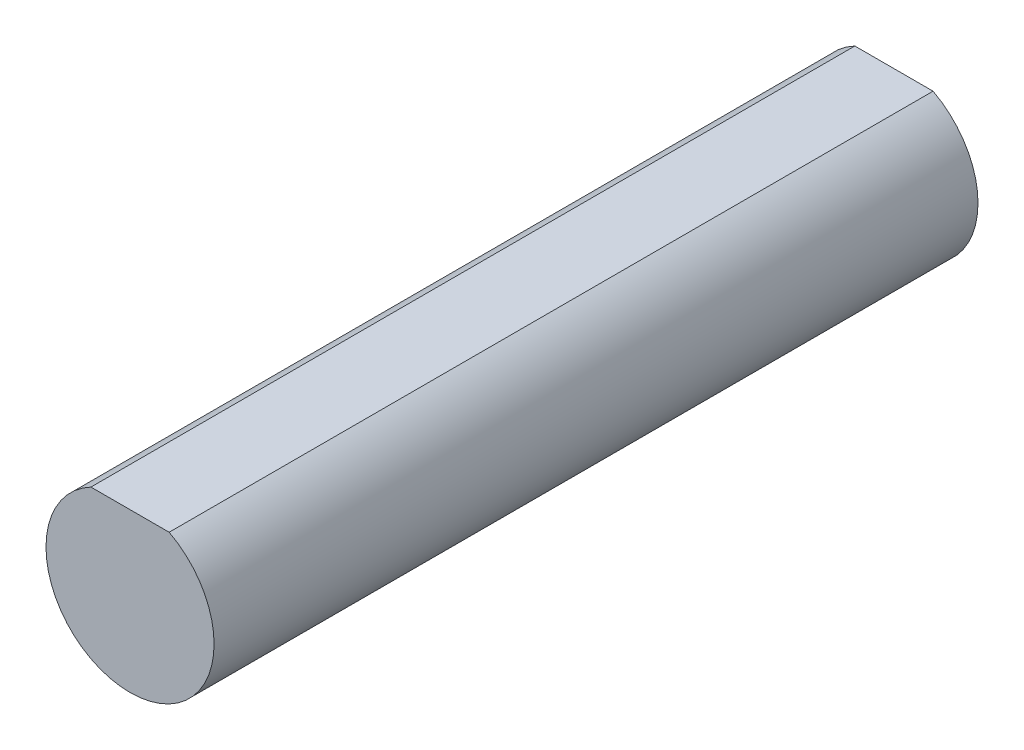
ISO-10303-21;
HEADER;
FILE_DESCRIPTION(('STEP AP214'),'2;1');
FILE_NAME('part.step','',(''),(''),'','','');
FILE_SCHEMA(('AUTOMOTIVE_DESIGN { 1 0 10303 214 1 1 1 1 }'));
ENDSEC;
DATA;
#1=APPLICATION_CONTEXT('core data for automotive mechanical design processes');
#2=APPLICATION_PROTOCOL_DEFINITION('international standard','automotive_design',2000,#1);
#3=PRODUCT_CONTEXT('',#1,'mechanical');
#4=PRODUCT('Part','Part','',(#3));
#5=PRODUCT_RELATED_PRODUCT_CATEGORY('part','',(#4));
#6=PRODUCT_DEFINITION_FORMATION('','',#4);
#7=PRODUCT_DEFINITION_CONTEXT('part definition',#1,'design');
#8=PRODUCT_DEFINITION('design','',#6,#7);
#9=PRODUCT_DEFINITION_SHAPE('','',#8);
#10=(LENGTH_UNIT() NAMED_UNIT(*) SI_UNIT(.MILLI.,.METRE.));
#11=(NAMED_UNIT(*) PLANE_ANGLE_UNIT() SI_UNIT($,.RADIAN.));
#12=(NAMED_UNIT(*) SI_UNIT($,.STERADIAN.) SOLID_ANGLE_UNIT());
#13=UNCERTAINTY_MEASURE_WITH_UNIT(LENGTH_MEASURE(1.E-05),#10,'distance_accuracy_value','');
#14=(GEOMETRIC_REPRESENTATION_CONTEXT(3) GLOBAL_UNCERTAINTY_ASSIGNED_CONTEXT((#13)) GLOBAL_UNIT_ASSIGNED_CONTEXT((#10,
#11,#12)) REPRESENTATION_CONTEXT('',''));
#15=CARTESIAN_POINT('',(0.,0.,0.));
#16=DIRECTION('',(0.,0.,1.));
#17=DIRECTION('',(1.,0.,0.));
#18=AXIS2_PLACEMENT_3D('',#15,#16,#17);
#19=CARTESIAN_POINT('',(0.,0.,0.));
#20=DIRECTION('',(0.,0.,1.));
#21=DIRECTION('',(1.,0.,0.));
#22=AXIS2_PLACEMENT_3D('',#19,#20,#21);
#23=PLANE('',#22);
#24=CARTESIAN_POINT('',(0.,0.,0.));
#25=DIRECTION('',(0.,0.,1.));
#26=DIRECTION('',(1.,0.,0.));
#27=AXIS2_PLACEMENT_3D('',#24,#25,#26);
#28=CIRCLE('',#27,2.54);
#29=CARTESIAN_POINT('',(-1.18260119651555,2.2479,0.));
#30=VERTEX_POINT('',#29);
#31=CARTESIAN_POINT('',(1.18260119651555,2.2479,0.));
#32=VERTEX_POINT('',#31);
#33=EDGE_CURVE('E52',#30,#32,#28,.T.);
#34=ORIENTED_EDGE('',*,*,#33,.F.);
#35=DIRECTION('',(-1.,0.,0.));
#36=VECTOR('',#35,1.);
#37=CARTESIAN_POINT('',(1.18260119651555,2.2479,0.));
#38=LINE('',#37,#36);
#39=EDGE_CURVE('E75',#32,#30,#38,.T.);
#40=ORIENTED_EDGE('',*,*,#39,.F.);
#41=EDGE_LOOP('',(#34,#40));
#42=FACE_BOUND('',#41,.T.);
#43=ADVANCED_FACE('F48',(#42),#23,.F.);
#44=CARTESIAN_POINT('',(0.,0.,23.0886));
#45=DIRECTION('',(0.,0.,-1.));
#46=DIRECTION('',(-1.,0.,0.));
#47=AXIS2_PLACEMENT_3D('',#44,#45,#46);
#48=CYLINDRICAL_SURFACE('',#47,2.54);
#49=CARTESIAN_POINT('',(0.,0.,23.0886));
#50=DIRECTION('',(0.,0.,1.));
#51=DIRECTION('',(1.,0.,0.));
#52=AXIS2_PLACEMENT_3D('',#49,#50,#51);
#53=CIRCLE('',#52,2.54);
#54=CARTESIAN_POINT('',(-1.18260119651555,2.2479,23.0886));
#55=VERTEX_POINT('',#54);
#56=CARTESIAN_POINT('',(1.18260119651555,2.2479,23.0886));
#57=VERTEX_POINT('',#56);
#58=EDGE_CURVE('E12',#55,#57,#53,.T.);
#59=ORIENTED_EDGE('',*,*,#58,.F.);
#60=DIRECTION('',(0.,0.,-1.));
#61=VECTOR('',#60,1.);
#62=CARTESIAN_POINT('',(-1.18260119651555,2.2479,23.0886));
#63=LINE('',#62,#61);
#64=EDGE_CURVE('E63',#55,#30,#63,.T.);
#65=ORIENTED_EDGE('',*,*,#64,.T.);
#66=ORIENTED_EDGE('',*,*,#33,.T.);
#67=DIRECTION('',(0.,0.,-1.));
#68=VECTOR('',#67,1.);
#69=CARTESIAN_POINT('',(1.18260119651555,2.2479,23.0886));
#70=LINE('',#69,#68);
#71=EDGE_CURVE('E72',#57,#32,#70,.T.);
#72=ORIENTED_EDGE('',*,*,#71,.F.);
#73=EDGE_LOOP('',(#59,#65,#66,#72));
#74=FACE_BOUND('',#73,.T.);
#75=ADVANCED_FACE('F50',(#74),#48,.T.);
#76=CARTESIAN_POINT('',(0.,0.,23.0886));
#77=DIRECTION('',(0.,0.,1.));
#78=DIRECTION('',(1.,0.,0.));
#79=AXIS2_PLACEMENT_3D('',#76,#77,#78);
#80=PLANE('',#79);
#81=DIRECTION('',(-1.,0.,0.));
#82=VECTOR('',#81,1.);
#83=CARTESIAN_POINT('',(1.18260119651555,2.2479,23.0886));
#84=LINE('',#83,#82);
#85=EDGE_CURVE('E68',#57,#55,#84,.T.);
#86=ORIENTED_EDGE('',*,*,#85,.T.);
#87=ORIENTED_EDGE('',*,*,#58,.T.);
#88=EDGE_LOOP('',(#86,#87));
#89=FACE_BOUND('',#88,.T.);
#90=ADVANCED_FACE('F86',(#89),#80,.T.);
#91=CARTESIAN_POINT('',(1.18260119651555,2.2479,23.0886));
#92=DIRECTION('',(0.,-1.,0.));
#93=DIRECTION('',(0.,0.,-1.));
#94=AXIS2_PLACEMENT_3D('',#91,#92,#93);
#95=PLANE('',#94);
#96=ORIENTED_EDGE('',*,*,#39,.T.);
#97=ORIENTED_EDGE('',*,*,#64,.F.);
#98=ORIENTED_EDGE('',*,*,#85,.F.);
#99=ORIENTED_EDGE('',*,*,#71,.T.);
#100=EDGE_LOOP('',(#96,#97,#98,#99));
#101=FACE_BOUND('',#100,.T.);
#102=ADVANCED_FACE('F74',(#101),#95,.F.);
#103=CLOSED_SHELL('',(#43,#75,#90,#102));
#104=MANIFOLD_SOLID_BREP('B2',#103);
#105=ADVANCED_BREP_SHAPE_REPRESENTATION('',(#18,#104),#14);
#106=SHAPE_DEFINITION_REPRESENTATION(#9,#105);
ENDSEC;
END-ISO-10303-21;
